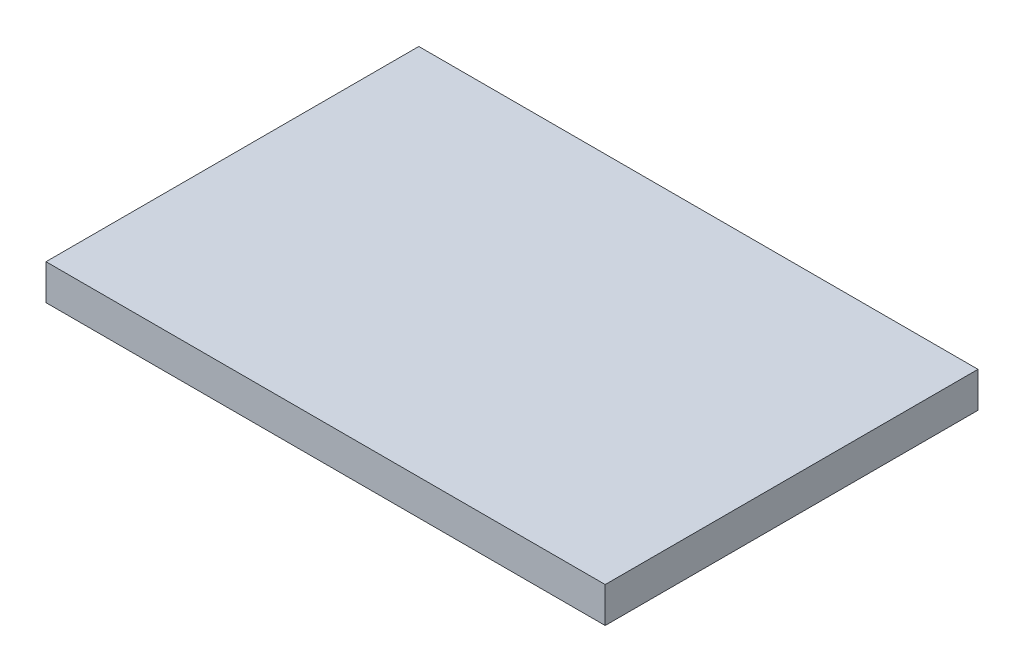
ISO-10303-21;
HEADER;
FILE_DESCRIPTION(('STEP AP214'),'2;1');
FILE_NAME('part.step','',(''),(''),'','','');
FILE_SCHEMA(('AUTOMOTIVE_DESIGN { 1 0 10303 214 1 1 1 1 }'));
ENDSEC;
DATA;
#1=APPLICATION_CONTEXT('core data for automotive mechanical design processes');
#2=APPLICATION_PROTOCOL_DEFINITION('international standard','automotive_design',2000,#1);
#3=PRODUCT_CONTEXT('',#1,'mechanical');
#4=PRODUCT('Part','Part','',(#3));
#5=PRODUCT_RELATED_PRODUCT_CATEGORY('part','',(#4));
#6=PRODUCT_DEFINITION_FORMATION('','',#4);
#7=PRODUCT_DEFINITION_CONTEXT('part definition',#1,'design');
#8=PRODUCT_DEFINITION('design','',#6,#7);
#9=PRODUCT_DEFINITION_SHAPE('','',#8);
#10=(LENGTH_UNIT() NAMED_UNIT(*) SI_UNIT(.MILLI.,.METRE.));
#11=(NAMED_UNIT(*) PLANE_ANGLE_UNIT() SI_UNIT($,.RADIAN.));
#12=(NAMED_UNIT(*) SI_UNIT($,.STERADIAN.) SOLID_ANGLE_UNIT());
#13=UNCERTAINTY_MEASURE_WITH_UNIT(LENGTH_MEASURE(1.E-05),#10,'distance_accuracy_value','');
#14=(GEOMETRIC_REPRESENTATION_CONTEXT(3) GLOBAL_UNCERTAINTY_ASSIGNED_CONTEXT((#13)) GLOBAL_UNIT_ASSIGNED_CONTEXT((#10,
#11,#12)) REPRESENTATION_CONTEXT('',''));
#15=CARTESIAN_POINT('',(0.,0.,0.));
#16=DIRECTION('',(0.,0.,1.));
#17=DIRECTION('',(1.,0.,0.));
#18=AXIS2_PLACEMENT_3D('',#15,#16,#17);
#19=CARTESIAN_POINT('',(75.,189.802563773199,50.));
#20=DIRECTION('',(-1.,0.,0.));
#21=DIRECTION('',(0.,0.,1.));
#22=AXIS2_PLACEMENT_3D('',#19,#20,#21);
#23=PLANE('',#22);
#24=DIRECTION('',(0.,0.,-1.));
#25=VECTOR('',#24,1.);
#26=CARTESIAN_POINT('',(75.,9.52500000000001,50.));
#27=LINE('',#26,#25);
#28=CARTESIAN_POINT('',(75.,9.52500000000001,50.));
#29=VERTEX_POINT('',#28);
#30=CARTESIAN_POINT('',(75.,9.52500000000001,-50.));
#31=VERTEX_POINT('',#30);
#32=EDGE_CURVE('E83',#29,#31,#27,.T.);
#33=ORIENTED_EDGE('',*,*,#32,.F.);
#34=DIRECTION('',(0.,-1.,0.));
#35=VECTOR('',#34,1.);
#36=CARTESIAN_POINT('',(75.,189.802563773199,50.));
#37=LINE('',#36,#35);
#38=CARTESIAN_POINT('',(75.,0.,50.));
#39=VERTEX_POINT('',#38);
#40=EDGE_CURVE('E37',#29,#39,#37,.T.);
#41=ORIENTED_EDGE('',*,*,#40,.T.);
#42=DIRECTION('',(0.,0.,-1.));
#43=VECTOR('',#42,1.);
#44=CARTESIAN_POINT('',(75.,0.,50.));
#45=LINE('',#44,#43);
#46=CARTESIAN_POINT('',(75.,0.,-50.));
#47=VERTEX_POINT('',#46);
#48=EDGE_CURVE('E81',#39,#47,#45,.T.);
#49=ORIENTED_EDGE('',*,*,#48,.T.);
#50=DIRECTION('',(0.,-1.,0.));
#51=VECTOR('',#50,1.);
#52=CARTESIAN_POINT('',(75.,189.802563773199,-50.));
#53=LINE('',#52,#51);
#54=EDGE_CURVE('E72',#31,#47,#53,.T.);
#55=ORIENTED_EDGE('',*,*,#54,.F.);
#56=EDGE_LOOP('',(#33,#41,#49,#55));
#57=FACE_BOUND('',#56,.T.);
#58=ADVANCED_FACE('F33',(#57),#23,.F.);
#59=CARTESIAN_POINT('',(-75.,189.802563773199,-50.));
#60=DIRECTION('',(0.,0.,1.));
#61=DIRECTION('',(1.,0.,0.));
#62=AXIS2_PLACEMENT_3D('',#59,#60,#61);
#63=PLANE('',#62);
#64=DIRECTION('',(-1.,0.,0.));
#65=VECTOR('',#64,1.);
#66=CARTESIAN_POINT('',(-75.,9.52500000000001,-50.));
#67=LINE('',#66,#65);
#68=CARTESIAN_POINT('',(-75.,9.52500000000001,-50.));
#69=VERTEX_POINT('',#68);
#70=EDGE_CURVE('E42',#31,#69,#67,.T.);
#71=ORIENTED_EDGE('',*,*,#70,.F.);
#72=ORIENTED_EDGE('',*,*,#54,.T.);
#73=DIRECTION('',(-1.,0.,0.));
#74=VECTOR('',#73,1.);
#75=CARTESIAN_POINT('',(-75.,0.,-50.));
#76=LINE('',#75,#74);
#77=CARTESIAN_POINT('',(-75.,0.,-50.));
#78=VERTEX_POINT('',#77);
#79=EDGE_CURVE('E93',#47,#78,#76,.T.);
#80=ORIENTED_EDGE('',*,*,#79,.T.);
#81=DIRECTION('',(0.,-1.,0.));
#82=VECTOR('',#81,1.);
#83=CARTESIAN_POINT('',(-75.,189.802563773199,-50.));
#84=LINE('',#83,#82);
#85=EDGE_CURVE('E102',#69,#78,#84,.T.);
#86=ORIENTED_EDGE('',*,*,#85,.F.);
#87=EDGE_LOOP('',(#71,#72,#80,#86));
#88=FACE_BOUND('',#87,.T.);
#89=ADVANCED_FACE('F106',(#88),#63,.F.);
#90=CARTESIAN_POINT('',(-75.,189.802563773199,50.));
#91=DIRECTION('',(1.,0.,0.));
#92=DIRECTION('',(0.,0.,-1.));
#93=AXIS2_PLACEMENT_3D('',#90,#91,#92);
#94=PLANE('',#93);
#95=DIRECTION('',(0.,0.,1.));
#96=VECTOR('',#95,1.);
#97=CARTESIAN_POINT('',(-75.,9.52500000000001,50.));
#98=LINE('',#97,#96);
#99=CARTESIAN_POINT('',(-75.,9.52500000000001,50.));
#100=VERTEX_POINT('',#99);
#101=EDGE_CURVE('E11',#69,#100,#98,.T.);
#102=ORIENTED_EDGE('',*,*,#101,.F.);
#103=ORIENTED_EDGE('',*,*,#85,.T.);
#104=DIRECTION('',(0.,0.,1.));
#105=VECTOR('',#104,1.);
#106=CARTESIAN_POINT('',(-75.,0.,50.));
#107=LINE('',#106,#105);
#108=CARTESIAN_POINT('',(-75.,0.,50.));
#109=VERTEX_POINT('',#108);
#110=EDGE_CURVE('E103',#78,#109,#107,.T.);
#111=ORIENTED_EDGE('',*,*,#110,.T.);
#112=DIRECTION('',(0.,-1.,0.));
#113=VECTOR('',#112,1.);
#114=CARTESIAN_POINT('',(-75.,189.802563773199,50.));
#115=LINE('',#114,#113);
#116=EDGE_CURVE('E55',#100,#109,#115,.T.);
#117=ORIENTED_EDGE('',*,*,#116,.F.);
#118=EDGE_LOOP('',(#102,#103,#111,#117));
#119=FACE_BOUND('',#118,.T.);
#120=ADVANCED_FACE('F105',(#119),#94,.F.);
#121=CARTESIAN_POINT('',(-75.,189.802563773199,50.));
#122=DIRECTION('',(0.,0.,-1.));
#123=DIRECTION('',(-1.,0.,0.));
#124=AXIS2_PLACEMENT_3D('',#121,#122,#123);
#125=PLANE('',#124);
#126=DIRECTION('',(1.,0.,0.));
#127=VECTOR('',#126,1.);
#128=CARTESIAN_POINT('',(-75.,9.52500000000001,50.));
#129=LINE('',#128,#127);
#130=EDGE_CURVE('E90',#100,#29,#129,.T.);
#131=ORIENTED_EDGE('',*,*,#130,.F.);
#132=ORIENTED_EDGE('',*,*,#116,.T.);
#133=DIRECTION('',(1.,0.,0.));
#134=VECTOR('',#133,1.);
#135=CARTESIAN_POINT('',(-75.,0.,50.));
#136=LINE('',#135,#134);
#137=EDGE_CURVE('E86',#109,#39,#136,.T.);
#138=ORIENTED_EDGE('',*,*,#137,.T.);
#139=ORIENTED_EDGE('',*,*,#40,.F.);
#140=EDGE_LOOP('',(#131,#132,#138,#139));
#141=FACE_BOUND('',#140,.T.);
#142=ADVANCED_FACE('F87',(#141),#125,.F.);
#143=CARTESIAN_POINT('',(0.,0.,0.));
#144=DIRECTION('',(0.,-1.,0.));
#145=DIRECTION('',(0.,0.,-1.));
#146=AXIS2_PLACEMENT_3D('',#143,#144,#145);
#147=PLANE('',#146);
#148=ORIENTED_EDGE('',*,*,#48,.F.);
#149=ORIENTED_EDGE('',*,*,#137,.F.);
#150=ORIENTED_EDGE('',*,*,#110,.F.);
#151=ORIENTED_EDGE('',*,*,#79,.F.);
#152=EDGE_LOOP('',(#148,#149,#150,#151));
#153=FACE_BOUND('',#152,.T.);
#154=ADVANCED_FACE('F92',(#153),#147,.T.);
#155=CARTESIAN_POINT('',(0.,9.525,0.));
#156=DIRECTION('',(0.,1.,0.));
#157=DIRECTION('',(0.,0.,1.));
#158=AXIS2_PLACEMENT_3D('',#155,#156,#157);
#159=PLANE('',#158);
#160=ORIENTED_EDGE('',*,*,#130,.T.);
#161=ORIENTED_EDGE('',*,*,#32,.T.);
#162=ORIENTED_EDGE('',*,*,#70,.T.);
#163=ORIENTED_EDGE('',*,*,#101,.T.);
#164=EDGE_LOOP('',(#160,#161,#162,#163));
#165=FACE_BOUND('',#164,.T.);
#166=ADVANCED_FACE('F35',(#165),#159,.T.);
#167=CLOSED_SHELL('',(#58,#89,#120,#142,#154,#166));
#168=MANIFOLD_SOLID_BREP('B2',#167);
#169=ADVANCED_BREP_SHAPE_REPRESENTATION('',(#18,#168),#14);
#170=SHAPE_DEFINITION_REPRESENTATION(#9,#169);
ENDSEC;
END-ISO-10303-21;
